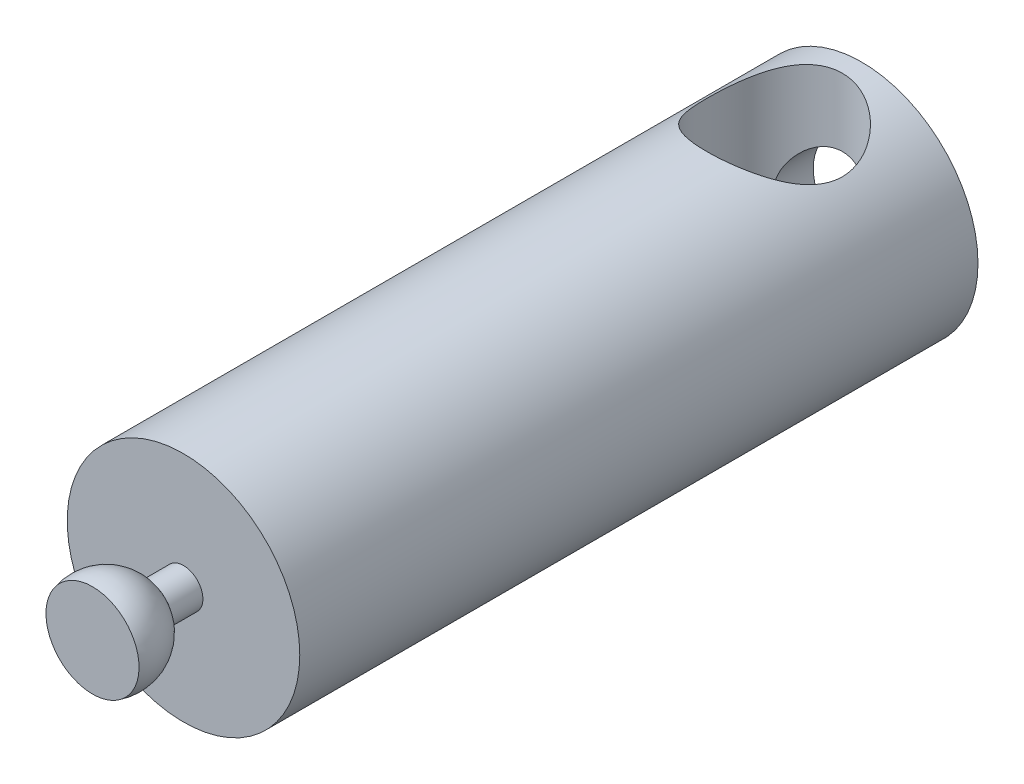
ISO-10303-21;
HEADER;
FILE_DESCRIPTION(('STEP AP214'),'2;1');
FILE_NAME('part.step','',(''),(''),'','','');
FILE_SCHEMA(('AUTOMOTIVE_DESIGN { 1 0 10303 214 1 1 1 1 }'));
ENDSEC;
DATA;
#1=APPLICATION_CONTEXT('core data for automotive mechanical design processes');
#2=APPLICATION_PROTOCOL_DEFINITION('international standard','automotive_design',2000,#1);
#3=PRODUCT_CONTEXT('',#1,'mechanical');
#4=PRODUCT('Part','Part','',(#3));
#5=PRODUCT_RELATED_PRODUCT_CATEGORY('part','',(#4));
#6=PRODUCT_DEFINITION_FORMATION('','',#4);
#7=PRODUCT_DEFINITION_CONTEXT('part definition',#1,'design');
#8=PRODUCT_DEFINITION('design','',#6,#7);
#9=PRODUCT_DEFINITION_SHAPE('','',#8);
#10=(LENGTH_UNIT() NAMED_UNIT(*) SI_UNIT(.MILLI.,.METRE.));
#11=(NAMED_UNIT(*) PLANE_ANGLE_UNIT() SI_UNIT($,.RADIAN.));
#12=(NAMED_UNIT(*) SI_UNIT($,.STERADIAN.) SOLID_ANGLE_UNIT());
#13=UNCERTAINTY_MEASURE_WITH_UNIT(LENGTH_MEASURE(1.E-05),#10,'distance_accuracy_value','');
#14=(GEOMETRIC_REPRESENTATION_CONTEXT(3) GLOBAL_UNCERTAINTY_ASSIGNED_CONTEXT((#13)) GLOBAL_UNIT_ASSIGNED_CONTEXT((#10,
#11,#12)) REPRESENTATION_CONTEXT('',''));
#15=CARTESIAN_POINT('',(0.,0.,0.));
#16=DIRECTION('',(0.,0.,1.));
#17=DIRECTION('',(1.,0.,0.));
#18=AXIS2_PLACEMENT_3D('',#15,#16,#17);
#19=CARTESIAN_POINT('',(0.,0.,8.));
#20=DIRECTION('',(0.,0.,-1.));
#21=DIRECTION('',(-1.,0.,0.));
#22=AXIS2_PLACEMENT_3D('',#19,#20,#21);
#23=PLANE('',#22);
#24=CARTESIAN_POINT('',(0.,0.,8.));
#25=DIRECTION('',(0.,0.,-1.));
#26=DIRECTION('',(-1.,0.,0.));
#27=AXIS2_PLACEMENT_3D('',#24,#25,#26);
#28=CIRCLE('',#27,2.5);
#29=CARTESIAN_POINT('',(0.,-2.5,8.));
#30=VERTEX_POINT('',#29);
#31=CARTESIAN_POINT('',(0.,2.5,8.));
#32=VERTEX_POINT('',#31);
#33=EDGE_CURVE('E56',#30,#32,#28,.T.);
#34=ORIENTED_EDGE('',*,*,#33,.T.);
#35=EDGE_CURVE('E49',#32,#30,#28,.T.);
#36=ORIENTED_EDGE('',*,*,#35,.T.);
#37=EDGE_LOOP('',(#34,#36));
#38=FACE_BOUND('',#37,.T.);
#39=CARTESIAN_POINT('',(0.,0.,8.));
#40=DIRECTION('',(0.,0.,-1.));
#41=DIRECTION('',(-1.,0.,0.));
#42=AXIS2_PLACEMENT_3D('',#39,#40,#41);
#43=CIRCLE('',#42,1.);
#44=CARTESIAN_POINT('',(-1.,0.,8.));
#45=VERTEX_POINT('',#44);
#46=EDGE_CURVE('E117',#45,#45,#43,.T.);
#47=ORIENTED_EDGE('',*,*,#46,.F.);
#48=EDGE_LOOP('',(#47));
#49=FACE_BOUND('',#48,.T.);
#50=ADVANCED_FACE('F34',(#38,#49),#23,.T.);
#51=CARTESIAN_POINT('',(0.,0.,35.));
#52=DIRECTION('',(0.,0.,-1.));
#53=DIRECTION('',(-1.,0.,0.));
#54=AXIS2_PLACEMENT_3D('',#51,#52,#53);
#55=CYLINDRICAL_SURFACE('',#54,6.);
#56=CARTESIAN_POINT('',(0.,-6.,8.));
#57=CARTESIAN_POINT('',(0.0899621842016999,-5.99999940705532,7.999999344979));
#58=CARTESIAN_POINT('',(0.179959123472136,-5.99797113274336,7.99652549070914));
#59=CARTESIAN_POINT('',(0.359279181505375,-5.98990699740743,7.98267375145587));
#60=CARTESIAN_POINT('',(0.448601797816938,-5.98386839889512,7.97229115048177));
#61=CARTESIAN_POINT('',(0.626048243263435,-5.96791503780685,7.94472607587532));
#62=CARTESIAN_POINT('',(0.714169031319306,-5.95799184607172,7.92752881414367));
#63=CARTESIAN_POINT('',(0.888388196147668,-5.93451883712606,7.88656029192718));
#64=CARTESIAN_POINT('',(0.974485683925673,-5.92096745701802,7.86278619822453));
#65=CARTESIAN_POINT('',(1.22795193693791,-5.87549044108281,7.78228254868244));
#66=CARTESIAN_POINT('',(1.39157911080687,-5.83863857796371,7.71619899902307));
#67=CARTESIAN_POINT('',(1.70485306237609,-5.75498500284211,7.56170731941832));
#68=CARTESIAN_POINT('',(1.85450459024161,-5.7081866893732,7.47330681286643));
#69=CARTESIAN_POINT('',(2.14825204388916,-5.60455210541238,7.26934942490433));
#70=CARTESIAN_POINT('',(2.29111541335043,-5.54722907494987,7.15226606318091));
#71=CARTESIAN_POINT('',(2.55637666788825,-5.4301030544073,6.89766667401416));
#72=CARTESIAN_POINT('',(2.67874880147822,-5.37029705995946,6.76012534051895));
#73=CARTESIAN_POINT('',(2.91372645980217,-5.24687865780905,6.4499418739621));
#74=CARTESIAN_POINT('',(3.023613987063,-5.18361328174864,6.27508434232938));
#75=CARTESIAN_POINT('',(3.21198955709959,-5.06905701564854,5.90567797214929));
#76=CARTESIAN_POINT('',(3.29052679284978,-5.0177474184173,5.71116058858183));
#77=CARTESIAN_POINT('',(3.3981959438312,-4.94524723148708,5.35362266177146));
#78=CARTESIAN_POINT('',(3.43453185280106,-4.91984581185326,5.19362774822004));
#79=CARTESIAN_POINT('',(3.48441762747016,-4.88464999348731,4.86851077352308));
#80=CARTESIAN_POINT('',(3.4979934668325,-4.87483780508295,4.70339477609203));
#81=CARTESIAN_POINT('',(3.50159501400216,-4.87225207387588,4.37250765848925));
#82=CARTESIAN_POINT('',(3.49158314435522,-4.87950571853604,4.20673591356244));
#83=CARTESIAN_POINT('',(3.44854447624329,-4.91001053927536,3.87968395128125));
#84=CARTESIAN_POINT('',(3.41550121705183,-4.93327315695062,3.71840703220671));
#85=CARTESIAN_POINT('',(3.32840818064216,-4.99243522012918,3.40551007740121));
#86=CARTESIAN_POINT('',(3.27451478757804,-5.02824040676167,3.25382770797727));
#87=CARTESIAN_POINT('',(3.14763556587525,-5.10862226659795,2.96121540476717));
#88=CARTESIAN_POINT('',(3.07464255582214,-5.15320223753611,2.82028954120327));
#89=CARTESIAN_POINT('',(2.8976053982461,-5.25508726886635,2.52828062995961));
#90=CARTESIAN_POINT('',(2.79041543853219,-5.31327541003335,2.37940953620583));
#91=CARTESIAN_POINT('',(2.55439792135506,-5.43069826274646,2.10030615153668));
#92=CARTESIAN_POINT('',(2.4255509421862,-5.48993387059701,1.97009078671601));
#93=CARTESIAN_POINT('',(2.1306271041862,-5.61148764416563,1.71561404503905));
#94=CARTESIAN_POINT('',(1.96191474322216,-5.67327691399843,1.59409422941144));
#95=CARTESIAN_POINT('',(1.69274613625394,-5.7570400122716,1.43478847963492));
#96=CARTESIAN_POINT('',(1.60029853664453,-5.78348329258615,1.38550000132137));
#97=CARTESIAN_POINT('',(1.41056352156908,-5.8326567590854,1.29510843850777));
#98=CARTESIAN_POINT('',(1.31327910935177,-5.85538921272546,1.25400035208943));
#99=CARTESIAN_POINT('',(1.12118402811535,-5.8950760463397,1.18296390008847));
#100=CARTESIAN_POINT('',(1.02663935486807,-5.91231421426126,1.15247371851615));
#101=CARTESIAN_POINT('',(0.834695284408373,-5.94244994910546,1.09953151504973));
#102=CARTESIAN_POINT('',(0.737297481922027,-5.95534989234232,1.07707509213726));
#103=CARTESIAN_POINT('',(0.540500524879268,-5.97642417050811,1.04053925562981));
#104=CARTESIAN_POINT('',(0.441102681196727,-5.98460150264121,1.02645452877361));
#105=CARTESIAN_POINT('',(0.24118752147363,-5.99598613235849,1.00687624700017));
#106=CARTESIAN_POINT('',(0.140670344887629,-5.99919404224354,1.00138163366257));
#107=CARTESIAN_POINT('',(-0.0476500287328656,-6.00045229485502,0.99922465385498));
#108=CARTESIAN_POINT('',(-0.135438590848441,-5.99910862745508,1.00152455820664));
#109=CARTESIAN_POINT('',(-0.310461993330544,-5.99260403927114,1.01269182949206));
#110=CARTESIAN_POINT('',(-0.39769665293615,-5.98744193105945,1.02156123935841));
#111=CARTESIAN_POINT('',(-0.657520099512283,-5.96638262286715,1.05788512114811));
#112=CARTESIAN_POINT('',(-0.828422689977264,-5.94491336191052,1.09505335352384));
#113=CARTESIAN_POINT('',(-1.15808876666692,-5.8895184376044,1.19273559942258));
#114=CARTESIAN_POINT('',(-1.31700110317444,-5.85579439314154,1.25287250114682));
#115=CARTESIAN_POINT('',(-1.62255442838773,-5.77859485954367,1.39425308799117));
#116=CARTESIAN_POINT('',(-1.76919268722314,-5.73511720898612,1.4755014520946));
#117=CARTESIAN_POINT('',(-2.06250330843421,-5.63670505849237,1.6663068517907));
#118=CARTESIAN_POINT('',(-2.20758407137202,-5.58104858397804,1.77793260505315));
#119=CARTESIAN_POINT('',(-2.4780793032594,-5.46632933394456,2.02162906369722));
#120=CARTESIAN_POINT('',(-2.60347056780368,-5.40726264985705,2.15372353307513));
#121=CARTESIAN_POINT('',(-2.84636081556061,-5.2838349558923,2.45312112891092));
#122=CARTESIAN_POINT('',(-2.96112553039478,-5.2196848827806,2.62274539799034));
#123=CARTESIAN_POINT('',(-3.16038820338437,-5.10151027475494,2.98210071946081));
#124=CARTESIAN_POINT('',(-3.24492348040676,-5.04747329459455,3.17180660289635));
#125=CARTESIAN_POINT('',(-3.36531429748045,-4.96776744065978,3.52454779574634));
#126=CARTESIAN_POINT('',(-3.40773412765483,-4.93849487756635,3.68452221652442));
#127=CARTESIAN_POINT('',(-3.46960492167826,-4.89523317923762,4.01079093510767));
#128=CARTESIAN_POINT('',(-3.489084460678,-4.88122503179369,4.17707710357673));
#129=CARTESIAN_POINT('',(-3.50399594756399,-4.87053514207999,4.5117532202431));
#130=CARTESIAN_POINT('',(-3.49936339883644,-4.87389986973792,4.68014760767355));
#131=CARTESIAN_POINT('',(-3.46619534757535,-4.89753765573747,5.01338781935982));
#132=CARTESIAN_POINT('',(-3.43764527821143,-4.91782101824514,5.17823141825647));
#133=CARTESIAN_POINT('',(-3.35939658034854,-4.97157869971425,5.49516134899973));
#134=CARTESIAN_POINT('',(-3.31034376760202,-5.00464806903079,5.64748017565885));
#135=CARTESIAN_POINT('',(-3.19308606788782,-5.08026146937039,5.94199861353435));
#136=CARTESIAN_POINT('',(-3.12487392945043,-5.12280908648058,6.08419436775334));
#137=CARTESIAN_POINT('',(-2.95904753922133,-5.22059857811583,6.3779562012529));
#138=CARTESIAN_POINT('',(-2.85851524848139,-5.27678588540072,6.52756049479073));
#139=CARTESIAN_POINT('',(-2.63624236878869,-5.39128042536153,6.80921697519905));
#140=CARTESIAN_POINT('',(-2.51448515863006,-5.44958929089827,6.94125526220364));
#141=CARTESIAN_POINT('',(-2.23286219445595,-5.57143917603496,7.20299413509767));
#142=CARTESIAN_POINT('',(-2.07004703111802,-5.63456802501059,7.32977305151315));
#143=CARTESIAN_POINT('',(-1.80920666729129,-5.72147203378955,7.49791924302711));
#144=CARTESIAN_POINT('',(-1.71941205496244,-5.74916078272634,7.55033058248405));
#145=CARTESIAN_POINT('',(-1.53476261972514,-5.80117891858142,7.64727760192882));
#146=CARTESIAN_POINT('',(-1.4399107884699,-5.8255102617016,7.69181787230003));
#147=CARTESIAN_POINT('',(-1.25031817720422,-5.86904784303838,7.77058817523679));
#148=CARTESIAN_POINT('',(-1.15578010730151,-5.88844069632128,7.80520328441335));
#149=CARTESIAN_POINT('',(-0.963403250723157,-5.92295472951742,7.86630793151274));
#150=CARTESIAN_POINT('',(-0.865566420334689,-5.93807839302157,7.89280219449156));
#151=CARTESIAN_POINT('',(-0.667677878357151,-5.96356695531817,7.93721698560878));
#152=CARTESIAN_POINT('',(-0.567633831399916,-5.9739462261897,7.95516341453391));
#153=CARTESIAN_POINT('',(-0.366031363492446,-5.9896765248691,7.9822906809512));
#154=CARTESIAN_POINT('',(-0.264474378789153,-5.99503204684263,7.99147935311125));
#155=CARTESIAN_POINT('',(-0.135600842842583,-5.99852897810343,7.99747764565677));
#156=CARTESIAN_POINT('',(-0.108493391182483,-5.99908033765356,7.99842322822449));
#157=CARTESIAN_POINT('',(-0.0542583467885913,-5.99981593957898,7.99968450685542));
#158=CARTESIAN_POINT('',(-0.0271307538848228,-6.00000017881998,8.00000019754093));
#159=CARTESIAN_POINT('',(0.,-6.,8.));
#160=B_SPLINE_CURVE_WITH_KNOTS('',3,(#56,#57,#58,#59,#60,#61,#62,#63,#64,#65,#66,#67,#68,#69,
#70,#71,#72,#73,#74,#75,#76,#77,#78,#79,#80,#81,#82,#83,#84,#85,#86,#87,#88,#89,#90,#91,#92,#93,
#94,#95,#96,#97,#98,#99,#100,#101,#102,#103,#104,#105,#106,#107,#108,#109,#110,#111,#112,#113,
#114,#115,#116,#117,#118,#119,#120,#121,#122,#123,#124,#125,#126,#127,#128,#129,#130,#131,#132,
#133,#134,#135,#136,#137,#138,#139,#140,#141,#142,#143,#144,#145,#146,#147,#148,#149,#150,#151,
#152,#153,#154,#155,#156,#157,#158,#159),.UNSPECIFIED.,.T.,.F.,(4,2,2,2,2,2,2,2,2,2,2,2,2,2,2,2,
2,2,2,2,2,2,2,2,2,2,2,2,2,2,2,2,2,2,2,2,2,2,2,2,2,2,2,2,2,2,2,2,2,2,2,4),(0.,0.269857022230553,
0.539898441223979,0.81052909898963,1.08127652312956,1.61950432452768,2.15754851740577,
2.73544583741866,3.31406404167448,3.9588634393916,4.60264704184033,5.09858348127047,
5.59395357461927,6.0901133729436,6.58662814492187,7.07948888602377,7.57253520864789,
8.14762469114195,8.72323268451364,9.37023224992074,9.69399877078184,10.0175667114708,
10.3196086145674,10.6214848001053,10.9231691888501,11.2248164029905,11.4879654567385,
11.7511963768611,12.2770829521784,12.7946826161502,13.3123970949539,13.8841084077748,
14.4564885153885,15.0972759394319,15.737269544695,16.2393630156573,16.7408303993928,
17.2436398295979,17.746755715859,18.2350938681074,18.7236170974388,19.2878323305452,
19.852491401133,20.4962952131074,20.8187115384658,21.1409392065765,21.4480807758936,
21.7550432963678,22.0610696775496,22.3668220305958,22.4482046916946,22.5295880475924),.UNSPECIFIED.);
#161=CARTESIAN_POINT('',(0.,-6.,8.));
#162=VERTEX_POINT('',#161);
#163=EDGE_CURVE('E75',#162,#162,#160,.T.);
#164=ORIENTED_EDGE('',*,*,#163,.T.);
#165=EDGE_LOOP('',(#164));
#166=FACE_BOUND('',#165,.T.);
#167=CARTESIAN_POINT('',(0.,6.,8.));
#168=CARTESIAN_POINT('',(-0.0899621842016999,5.99999940705532,7.999999344979));
#169=CARTESIAN_POINT('',(-0.179959123472136,5.99797113274336,7.99652549070914));
#170=CARTESIAN_POINT('',(-0.359279181505375,5.98990699740743,7.98267375145587));
#171=CARTESIAN_POINT('',(-0.448601797816938,5.98386839889512,7.97229115048177));
#172=CARTESIAN_POINT('',(-0.626048243263435,5.96791503780685,7.94472607587532));
#173=CARTESIAN_POINT('',(-0.714169031319306,5.95799184607172,7.92752881414367));
#174=CARTESIAN_POINT('',(-0.888388196147668,5.93451883712606,7.88656029192718));
#175=CARTESIAN_POINT('',(-0.974485683925673,5.92096745701802,7.86278619822453));
#176=CARTESIAN_POINT('',(-1.22795193693791,5.87549044108281,7.78228254868244));
#177=CARTESIAN_POINT('',(-1.39157911080687,5.83863857796371,7.71619899902307));
#178=CARTESIAN_POINT('',(-1.70485306237609,5.75498500284211,7.56170731941832));
#179=CARTESIAN_POINT('',(-1.85450459024161,5.7081866893732,7.47330681286643));
#180=CARTESIAN_POINT('',(-2.14825204388916,5.60455210541238,7.26934942490433));
#181=CARTESIAN_POINT('',(-2.29111541335043,5.54722907494987,7.15226606318091));
#182=CARTESIAN_POINT('',(-2.55637666788825,5.4301030544073,6.89766667401416));
#183=CARTESIAN_POINT('',(-2.67874880147822,5.37029705995946,6.76012534051895));
#184=CARTESIAN_POINT('',(-2.91372645980217,5.24687865780905,6.4499418739621));
#185=CARTESIAN_POINT('',(-3.023613987063,5.18361328174864,6.27508434232938));
#186=CARTESIAN_POINT('',(-3.21198955709959,5.06905701564854,5.90567797214929));
#187=CARTESIAN_POINT('',(-3.29052679284978,5.0177474184173,5.71116058858183));
#188=CARTESIAN_POINT('',(-3.3981959438312,4.94524723148708,5.35362266177146));
#189=CARTESIAN_POINT('',(-3.43453185280106,4.91984581185326,5.19362774822004));
#190=CARTESIAN_POINT('',(-3.48441762747016,4.88464999348731,4.86851077352308));
#191=CARTESIAN_POINT('',(-3.4979934668325,4.87483780508295,4.70339477609203));
#192=CARTESIAN_POINT('',(-3.50159501400216,4.87225207387588,4.37250765848925));
#193=CARTESIAN_POINT('',(-3.49158314435522,4.87950571853604,4.20673591356244));
#194=CARTESIAN_POINT('',(-3.44854447624329,4.91001053927536,3.87968395128125));
#195=CARTESIAN_POINT('',(-3.41550121705183,4.93327315695062,3.71840703220671));
#196=CARTESIAN_POINT('',(-3.32840818064216,4.99243522012918,3.40551007740121));
#197=CARTESIAN_POINT('',(-3.27451478757804,5.02824040676167,3.25382770797727));
#198=CARTESIAN_POINT('',(-3.14763556587525,5.10862226659795,2.96121540476717));
#199=CARTESIAN_POINT('',(-3.07464255582214,5.15320223753611,2.82028954120327));
#200=CARTESIAN_POINT('',(-2.8976053982461,5.25508726886635,2.52828062995961));
#201=CARTESIAN_POINT('',(-2.79041543853219,5.31327541003335,2.37940953620583));
#202=CARTESIAN_POINT('',(-2.55439792135506,5.43069826274646,2.10030615153668));
#203=CARTESIAN_POINT('',(-2.4255509421862,5.48993387059701,1.97009078671601));
#204=CARTESIAN_POINT('',(-2.1306271041862,5.61148764416563,1.71561404503905));
#205=CARTESIAN_POINT('',(-1.96191474322216,5.67327691399843,1.59409422941144));
#206=CARTESIAN_POINT('',(-1.69274613625394,5.7570400122716,1.43478847963492));
#207=CARTESIAN_POINT('',(-1.60029853664453,5.78348329258615,1.38550000132137));
#208=CARTESIAN_POINT('',(-1.41056352156908,5.8326567590854,1.29510843850777));
#209=CARTESIAN_POINT('',(-1.31327910935177,5.85538921272546,1.25400035208943));
#210=CARTESIAN_POINT('',(-1.12118402811535,5.8950760463397,1.18296390008847));
#211=CARTESIAN_POINT('',(-1.02663935486807,5.91231421426126,1.15247371851615));
#212=CARTESIAN_POINT('',(-0.834695284408373,5.94244994910546,1.09953151504973));
#213=CARTESIAN_POINT('',(-0.737297481922027,5.95534989234232,1.07707509213726));
#214=CARTESIAN_POINT('',(-0.540500524879268,5.97642417050811,1.04053925562981));
#215=CARTESIAN_POINT('',(-0.441102681196727,5.98460150264121,1.02645452877361));
#216=CARTESIAN_POINT('',(-0.24118752147363,5.99598613235849,1.00687624700017));
#217=CARTESIAN_POINT('',(-0.140670344887629,5.99919404224354,1.00138163366257));
#218=CARTESIAN_POINT('',(0.0476500287328656,6.00045229485502,0.99922465385498));
#219=CARTESIAN_POINT('',(0.135438590848441,5.99910862745508,1.00152455820664));
#220=CARTESIAN_POINT('',(0.310461993330544,5.99260403927114,1.01269182949206));
#221=CARTESIAN_POINT('',(0.39769665293615,5.98744193105945,1.02156123935841));
#222=CARTESIAN_POINT('',(0.657520099512283,5.96638262286715,1.05788512114811));
#223=CARTESIAN_POINT('',(0.828422689977264,5.94491336191052,1.09505335352384));
#224=CARTESIAN_POINT('',(1.15808876666692,5.8895184376044,1.19273559942258));
#225=CARTESIAN_POINT('',(1.31700110317444,5.85579439314154,1.25287250114682));
#226=CARTESIAN_POINT('',(1.62255442838773,5.77859485954367,1.39425308799117));
#227=CARTESIAN_POINT('',(1.76919268722314,5.73511720898612,1.4755014520946));
#228=CARTESIAN_POINT('',(2.06250330843421,5.63670505849237,1.6663068517907));
#229=CARTESIAN_POINT('',(2.20758407137202,5.58104858397804,1.77793260505315));
#230=CARTESIAN_POINT('',(2.4780793032594,5.46632933394456,2.02162906369722));
#231=CARTESIAN_POINT('',(2.60347056780368,5.40726264985705,2.15372353307513));
#232=CARTESIAN_POINT('',(2.84636081556061,5.2838349558923,2.45312112891092));
#233=CARTESIAN_POINT('',(2.96112553039478,5.2196848827806,2.62274539799034));
#234=CARTESIAN_POINT('',(3.16038820338437,5.10151027475494,2.98210071946081));
#235=CARTESIAN_POINT('',(3.24492348040676,5.04747329459455,3.17180660289635));
#236=CARTESIAN_POINT('',(3.36531429748045,4.96776744065978,3.52454779574634));
#237=CARTESIAN_POINT('',(3.40773412765483,4.93849487756635,3.68452221652442));
#238=CARTESIAN_POINT('',(3.46960492167826,4.89523317923762,4.01079093510767));
#239=CARTESIAN_POINT('',(3.489084460678,4.88122503179369,4.17707710357673));
#240=CARTESIAN_POINT('',(3.50399594756399,4.87053514207999,4.5117532202431));
#241=CARTESIAN_POINT('',(3.49936339883644,4.87389986973792,4.68014760767355));
#242=CARTESIAN_POINT('',(3.46619534757535,4.89753765573747,5.01338781935982));
#243=CARTESIAN_POINT('',(3.43764527821143,4.91782101824514,5.17823141825647));
#244=CARTESIAN_POINT('',(3.35939658034854,4.97157869971425,5.49516134899973));
#245=CARTESIAN_POINT('',(3.31034376760202,5.00464806903079,5.64748017565885));
#246=CARTESIAN_POINT('',(3.19308606788782,5.08026146937039,5.94199861353435));
#247=CARTESIAN_POINT('',(3.12487392945043,5.12280908648058,6.08419436775334));
#248=CARTESIAN_POINT('',(2.95904753922133,5.22059857811583,6.3779562012529));
#249=CARTESIAN_POINT('',(2.85851524848139,5.27678588540072,6.52756049479073));
#250=CARTESIAN_POINT('',(2.63624236878869,5.39128042536153,6.80921697519905));
#251=CARTESIAN_POINT('',(2.51448515863006,5.44958929089827,6.94125526220364));
#252=CARTESIAN_POINT('',(2.23286219445595,5.57143917603496,7.20299413509767));
#253=CARTESIAN_POINT('',(2.07004703111802,5.63456802501059,7.32977305151315));
#254=CARTESIAN_POINT('',(1.80920666729129,5.72147203378955,7.49791924302711));
#255=CARTESIAN_POINT('',(1.71941205496244,5.74916078272634,7.55033058248405));
#256=CARTESIAN_POINT('',(1.53476261972514,5.80117891858142,7.64727760192882));
#257=CARTESIAN_POINT('',(1.4399107884699,5.8255102617016,7.69181787230003));
#258=CARTESIAN_POINT('',(1.25031817720422,5.86904784303838,7.77058817523679));
#259=CARTESIAN_POINT('',(1.15578010730151,5.88844069632128,7.80520328441335));
#260=CARTESIAN_POINT('',(0.963403250723157,5.92295472951742,7.86630793151274));
#261=CARTESIAN_POINT('',(0.865566420334689,5.93807839302157,7.89280219449156));
#262=CARTESIAN_POINT('',(0.667677878357151,5.96356695531817,7.93721698560878));
#263=CARTESIAN_POINT('',(0.567633831399916,5.9739462261897,7.95516341453391));
#264=CARTESIAN_POINT('',(0.366031363492446,5.9896765248691,7.9822906809512));
#265=CARTESIAN_POINT('',(0.264474378789153,5.99503204684263,7.99147935311125));
#266=CARTESIAN_POINT('',(0.135600842842583,5.99852897810343,7.99747764565677));
#267=CARTESIAN_POINT('',(0.108493391182483,5.99908033765356,7.99842322822449));
#268=CARTESIAN_POINT('',(0.0542583467885913,5.99981593957898,7.99968450685542));
#269=CARTESIAN_POINT('',(0.0271307538848228,6.00000017881998,8.00000019754093));
#270=CARTESIAN_POINT('',(0.,6.,8.));
#271=B_SPLINE_CURVE_WITH_KNOTS('',3,(#167,#168,#169,#170,#171,#172,#173,#174,#175,#176,#177,
#178,#179,#180,#181,#182,#183,#184,#185,#186,#187,#188,#189,#190,#191,#192,#193,#194,#195,#196,
#197,#198,#199,#200,#201,#202,#203,#204,#205,#206,#207,#208,#209,#210,#211,#212,#213,#214,#215,
#216,#217,#218,#219,#220,#221,#222,#223,#224,#225,#226,#227,#228,#229,#230,#231,#232,#233,#234,
#235,#236,#237,#238,#239,#240,#241,#242,#243,#244,#245,#246,#247,#248,#249,#250,#251,#252,#253,
#254,#255,#256,#257,#258,#259,#260,#261,#262,#263,#264,#265,#266,#267,#268,#269,#270),
.UNSPECIFIED.,.T.,.F.,(4,2,2,2,2,2,2,2,2,2,2,2,2,2,2,2,2,2,2,2,2,2,2,2,2,2,2,2,2,2,2,2,2,2,2,2,
2,2,2,2,2,2,2,2,2,2,2,2,2,2,2,4),(0.,0.269857022230553,0.539898441223979,0.81052909898963,
1.08127652312956,1.61950432452768,2.15754851740577,2.73544583741866,3.31406404167448,
3.9588634393916,4.60264704184033,5.09858348127047,5.59395357461927,6.0901133729436,
6.58662814492187,7.07948888602377,7.57253520864789,8.14762469114195,8.72323268451364,
9.37023224992074,9.69399877078184,10.0175667114708,10.3196086145674,10.6214848001053,
10.9231691888501,11.2248164029905,11.4879654567385,11.7511963768611,12.2770829521784,
12.7946826161502,13.3123970949539,13.8841084077748,14.4564885153885,15.0972759394319,
15.737269544695,16.2393630156573,16.7408303993928,17.2436398295979,17.746755715859,
18.2350938681074,18.7236170974388,19.2878323305452,19.852491401133,20.4962952131074,
20.8187115384658,21.1409392065765,21.4480807758936,21.7550432963678,22.0610696775496,
22.3668220305958,22.4482046916946,22.5295880475924),.UNSPECIFIED.);
#272=CARTESIAN_POINT('',(0.,6.,8.));
#273=VERTEX_POINT('',#272);
#274=EDGE_CURVE('E131',#273,#273,#271,.T.);
#275=ORIENTED_EDGE('',*,*,#274,.T.);
#276=EDGE_LOOP('',(#275));
#277=FACE_BOUND('',#276,.T.);
#278=CARTESIAN_POINT('',(0.,0.,35.));
#279=DIRECTION('',(0.,0.,1.));
#280=DIRECTION('',(1.,0.,0.));
#281=AXIS2_PLACEMENT_3D('',#278,#279,#280);
#282=CIRCLE('',#281,6.);
#283=CARTESIAN_POINT('',(6.,0.,35.));
#284=VERTEX_POINT('',#283);
#285=EDGE_CURVE('E60',#284,#284,#282,.T.);
#286=ORIENTED_EDGE('',*,*,#285,.F.);
#287=EDGE_LOOP('',(#286));
#288=FACE_BOUND('',#287,.T.);
#289=CARTESIAN_POINT('',(0.,0.,0.));
#290=DIRECTION('',(0.,0.,1.));
#291=DIRECTION('',(1.,0.,0.));
#292=AXIS2_PLACEMENT_3D('',#289,#290,#291);
#293=CIRCLE('',#292,6.);
#294=CARTESIAN_POINT('',(6.,0.,0.));
#295=VERTEX_POINT('',#294);
#296=EDGE_CURVE('E127',#295,#295,#293,.T.);
#297=ORIENTED_EDGE('',*,*,#296,.T.);
#298=EDGE_LOOP('',(#297));
#299=FACE_BOUND('',#298,.T.);
#300=ADVANCED_FACE('F36',(#166,#277,#288,#299),#55,.T.);
#301=CARTESIAN_POINT('',(0.,0.,35.));
#302=DIRECTION('',(0.,0.,1.));
#303=DIRECTION('',(1.,0.,0.));
#304=AXIS2_PLACEMENT_3D('',#301,#302,#303);
#305=PLANE('',#304);
#306=CARTESIAN_POINT('',(0.,0.,35.));
#307=DIRECTION('',(0.,0.,1.));
#308=DIRECTION('',(1.,0.,0.));
#309=AXIS2_PLACEMENT_3D('',#306,#307,#308);
#310=CIRCLE('',#309,1.);
#311=CARTESIAN_POINT('',(1.,0.,35.));
#312=VERTEX_POINT('',#311);
#313=EDGE_CURVE('E11',#312,#312,#310,.T.);
#314=ORIENTED_EDGE('',*,*,#313,.F.);
#315=EDGE_LOOP('',(#314));
#316=FACE_BOUND('',#315,.T.);
#317=ORIENTED_EDGE('',*,*,#285,.T.);
#318=EDGE_LOOP('',(#317));
#319=FACE_BOUND('',#318,.T.);
#320=ADVANCED_FACE('F210',(#316,#319),#305,.T.);
#321=CARTESIAN_POINT('',(0.,0.,0.));
#322=DIRECTION('',(0.,0.,1.));
#323=DIRECTION('',(1.,0.,0.));
#324=AXIS2_PLACEMENT_3D('',#321,#322,#323);
#325=PLANE('',#324);
#326=CARTESIAN_POINT('',(0.,0.,0.));
#327=DIRECTION('',(0.,0.,-1.));
#328=DIRECTION('',(-1.,0.,0.));
#329=AXIS2_PLACEMENT_3D('',#326,#327,#328);
#330=CIRCLE('',#329,2.5);
#331=CARTESIAN_POINT('',(-2.5,0.,0.));
#332=VERTEX_POINT('',#331);
#333=EDGE_CURVE('E63',#332,#332,#330,.T.);
#334=ORIENTED_EDGE('',*,*,#333,.F.);
#335=EDGE_LOOP('',(#334));
#336=FACE_BOUND('',#335,.T.);
#337=ORIENTED_EDGE('',*,*,#296,.F.);
#338=EDGE_LOOP('',(#337));
#339=FACE_BOUND('',#338,.T.);
#340=ADVANCED_FACE('F147',(#336,#339),#325,.F.);
#341=CARTESIAN_POINT('',(0.,-17.5,4.5));
#342=DIRECTION('',(0.,1.,0.));
#343=DIRECTION('',(0.,0.,1.));
#344=AXIS2_PLACEMENT_3D('',#341,#342,#343);
#345=CYLINDRICAL_SURFACE('',#344,3.5);
#346=CARTESIAN_POINT('',(-2.5,0.,2.05051025721682));
#347=CARTESIAN_POINT('',(-2.50000008307986,0.0595437106329497,2.05051046198886));
#348=CARTESIAN_POINT('',(-2.49786660659943,0.119086436462475,2.04832650321261));
#349=CARTESIAN_POINT('',(-2.48939639218125,0.23757557283056,2.03972807883892));
#350=CARTESIAN_POINT('',(-2.48305754842775,0.296521669589108,2.03331149378514));
#351=CARTESIAN_POINT('',(-2.45790532115244,0.471813802352573,2.00815506890872));
#352=CARTESIAN_POINT('',(-2.43295665240151,0.586498019394557,1.98350955589207));
#353=CARTESIAN_POINT('',(-2.36895101285965,0.806944816876994,1.92319248376528));
#354=CARTESIAN_POINT('',(-2.33006279022612,0.912796194156667,1.88765351303002));
#355=CARTESIAN_POINT('',(-2.23974108711768,1.11621650244909,1.80981006351996));
#356=CARTESIAN_POINT('',(-2.18830809520747,1.21378575581545,1.76750584824437));
#357=CARTESIAN_POINT('',(-2.06335507760735,1.41751969017806,1.67160116174226));
#358=CARTESIAN_POINT('',(-1.98751158636828,1.52195596618389,1.61735547410889));
#359=CARTESIAN_POINT('',(-1.82058511502999,1.71816742439166,1.50911069709705));
#360=CARTESIAN_POINT('',(-1.72948196920773,1.80992555561569,1.45511203246493));
#361=CARTESIAN_POINT('',(-1.51515057128363,1.99439636068074,1.34224959166554));
#362=CARTESIAN_POINT('',(-1.38909031330179,2.08441421569328,1.28421148171829));
#363=CARTESIAN_POINT('',(-1.1865546298702,2.20185879759366,1.20646961144519));
#364=CARTESIAN_POINT('',(-1.11682337043763,2.23806890422528,1.18211374983762));
#365=CARTESIAN_POINT('',(-0.97326199122785,2.30412695052937,1.13720191498466));
#366=CARTESIAN_POINT('',(-0.899433778511979,2.33397781952023,1.11664419274668));
#367=CARTESIAN_POINT('',(-0.714757722344395,2.39842360791491,1.07192804926002));
#368=CARTESIAN_POINT('',(-0.601969079381502,2.42928476019379,1.05019358514386));
#369=CARTESIAN_POINT('',(-0.371714557114898,2.47499298390265,1.01785573748725));
#370=CARTESIAN_POINT('',(-0.254252582802319,2.4898531458315,1.00724325518202));
#371=CARTESIAN_POINT('',(-0.0176657677424759,2.50274742303506,0.998040136227748));
#372=CARTESIAN_POINT('',(0.101462066439368,2.50074585713761,0.999474992981455));
#373=CARTESIAN_POINT('',(0.337487754159482,2.47994918074624,1.01430120142838));
#374=CARTESIAN_POINT('',(0.454385004891486,2.46114959450703,1.02769573971594));
#375=CARTESIAN_POINT('',(0.679693407052132,2.40853978752676,1.06478124008709));
#376=CARTESIAN_POINT('',(0.788246129715222,2.37513225451446,1.08819564484925));
#377=CARTESIAN_POINT('',(0.997932841489391,2.29493891074344,1.14352800963692));
#378=CARTESIAN_POINT('',(1.09906531627568,2.24815037867898,1.17544769929956));
#379=CARTESIAN_POINT('',(1.30329917068145,2.13691485126298,1.24969287768369));
#380=CARTESIAN_POINT('',(1.40536259666555,2.07108055999881,1.29278180855476));
#381=CARTESIAN_POINT('',(1.59757774740133,1.9267124978097,1.38405843279474));
#382=CARTESIAN_POINT('',(1.68771722443517,1.84816585062256,1.432251278597));
#383=CARTESIAN_POINT('',(1.87089930689328,1.66420307206913,1.53976699231002));
#384=CARTESIAN_POINT('',(1.9614108165082,1.55650315386709,1.5995032137162));
#385=CARTESIAN_POINT('',(2.12378275350573,1.3264109094215,1.71620320682366));
#386=CARTESIAN_POINT('',(2.1956442130505,1.20401939681319,1.77316713181216));
#387=CARTESIAN_POINT('',(2.3049168673029,0.974510299233928,1.865371253181));
#388=CARTESIAN_POINT('',(2.34644193960731,0.870162699437319,1.90261445038899));
#389=CARTESIAN_POINT('',(2.415614393189,0.653917272017321,1.96680864417213));
#390=CARTESIAN_POINT('',(2.44328746344924,0.542033860467925,1.9937786702936));
#391=CARTESIAN_POINT('',(2.4732219649483,0.369661125165319,2.02343677113208));
#392=CARTESIAN_POINT('',(2.48128458251428,0.311053917850121,2.03153977620308));
#393=CARTESIAN_POINT('',(2.49324280178794,0.193006902693883,2.04361735218295));
#394=CARTESIAN_POINT('',(2.49714067110394,0.133567565807923,2.04759416967061));
#395=CARTESIAN_POINT('',(2.50066795026718,0.0144492734681499,2.0511907785458));
#396=CARTESIAN_POINT('',(2.50029884588415,-0.0452295913461829,2.05081208653166));
#397=CARTESIAN_POINT('',(2.49531288291151,-0.164206447807309,2.04573367550587));
#398=CARTESIAN_POINT('',(2.49069628622142,-0.223504462710227,2.04103422291145));
#399=CARTESIAN_POINT('',(2.47275078855874,-0.381312300486065,2.02295036703136));
#400=CARTESIAN_POINT('',(2.45562809147563,-0.47899580653746,2.00582932008265));
#401=CARTESIAN_POINT('',(2.410640472379,-0.669668794636473,1.96232904673575));
#402=CARTESIAN_POINT('',(2.38276290679705,-0.762652605593605,1.93593892677353));
#403=CARTESIAN_POINT('',(2.30162154734071,-0.986250800435989,1.86242931627135));
#404=CARTESIAN_POINT('',(2.24259540086997,-1.11350266922978,1.81144016492219));
#405=CARTESIAN_POINT('',(2.10582573050473,-1.35453985556953,1.70301211910217));
#406=CARTESIAN_POINT('',(2.02804474052118,-1.46829752873202,1.64556043872666));
#407=CARTESIAN_POINT('',(1.85312784875395,-1.6839251972605,1.52893482382249));
#408=CARTESIAN_POINT('',(1.75559315908709,-1.78546725076539,1.46975137108663));
#409=CARTESIAN_POINT('',(1.54331688123301,-1.97181802673858,1.35633636765261));
#410=CARTESIAN_POINT('',(1.42859939610046,-2.05664980954172,1.3020980489755));
#411=CARTESIAN_POINT('',(1.20143678094341,-2.19580443173875,1.21073839710532));
#412=CARTESIAN_POINT('',(1.09116965379627,-2.25278470148403,1.17227173470214));
#413=CARTESIAN_POINT('',(0.860760980775765,-2.35047141020132,1.10537995281085));
#414=CARTESIAN_POINT('',(0.740625099385913,-2.39118710713146,1.07694912190211));
#415=CARTESIAN_POINT('',(0.492513843791862,-2.45436433562489,1.03252341432902));
#416=CARTESIAN_POINT('',(0.364493535291681,-2.47670831833023,1.01660864770585));
#417=CARTESIAN_POINT('',(0.105575750324713,-2.50114612875279,0.999192407297193));
#418=CARTESIAN_POINT('',(-0.0253201741912314,-2.50325062295815,0.997683341512813));
#419=CARTESIAN_POINT('',(-0.271149336913014,-2.48797110877288,1.00858432719554));
#420=CARTESIAN_POINT('',(-0.386286879813447,-2.47265625832332,1.01951660965986));
#421=CARTESIAN_POINT('',(-0.611880581244257,-2.42669693585166,1.05201590310294));
#422=CARTESIAN_POINT('',(-0.722335942210633,-2.39604986342683,1.07358471806891));
#423=CARTESIAN_POINT('',(-0.938622183578509,-2.32001054719942,1.12632517851583));
#424=CARTESIAN_POINT('',(-1.04428329256542,-2.27428858505509,1.15771066413089));
#425=CARTESIAN_POINT('',(-1.24645015247123,-2.17009441939336,1.22771903309779));
#426=CARTESIAN_POINT('',(-1.34295420884927,-2.11161986254689,1.26634325208046));
#427=CARTESIAN_POINT('',(-1.53997825989659,-1.97359722473763,1.35486870452996));
#428=CARTESIAN_POINT('',(-1.6388241373156,-1.89219014270785,1.40559049192356));
#429=CARTESIAN_POINT('',(-1.82238683691836,-1.71613615958512,1.51000167448777));
#430=CARTESIAN_POINT('',(-1.90707682735716,-1.62146472693154,1.56369645412183));
#431=CARTESIAN_POINT('',(-2.07479876195784,-1.40263047702715,1.67914143426959));
#432=CARTESIAN_POINT('',(-2.155036498411,-1.27619625753481,1.74068745793195));
#433=CARTESIAN_POINT('',(-2.29291043085671,-1.00760940408258,1.85415129096203));
#434=CARTESIAN_POINT('',(-2.35058694625211,-0.865485397969225,1.9060861881142));
#435=CARTESIAN_POINT('',(-2.42914023407902,-0.602719767202217,1.97977873923247));
#436=CARTESIAN_POINT('',(-2.45550296689162,-0.484989517940959,2.00577364743044));
#437=CARTESIAN_POINT('',(-2.48208524424664,-0.304872951670374,2.03233034316611));
#438=CARTESIAN_POINT('',(-2.48878548014035,-0.244303623150184,2.03910943586862));
#439=CARTESIAN_POINT('',(-2.49774267674945,-0.122489154214156,2.04819914825717));
#440=CARTESIAN_POINT('',(-2.49999991454769,-0.0612440561815316,2.05051004659726));
#441=CARTESIAN_POINT('',(-2.5,0.,2.05051025721682));
#442=B_SPLINE_CURVE_WITH_KNOTS('',3,(#346,#347,#348,#349,#350,#351,#352,#353,#354,#355,#356,
#357,#358,#359,#360,#361,#362,#363,#364,#365,#366,#367,#368,#369,#370,#371,#372,#373,#374,#375,
#376,#377,#378,#379,#380,#381,#382,#383,#384,#385,#386,#387,#388,#389,#390,#391,#392,#393,#394,
#395,#396,#397,#398,#399,#400,#401,#402,#403,#404,#405,#406,#407,#408,#409,#410,#411,#412,#413,
#414,#415,#416,#417,#418,#419,#420,#421,#422,#423,#424,#425,#426,#427,#428,#429,#430,#431,#432,
#433,#434,#435,#436,#437,#438,#439,#440,#441),.UNSPECIFIED.,.T.,.F.,(4,2,2,2,2,2,2,2,2,2,2,2,2,
2,2,2,2,2,2,2,2,2,2,2,2,2,2,2,2,2,2,2,2,2,2,2,2,2,2,2,2,2,2,2,2,2,2,4),(0.,0.178547510494679,
0.35718449527553,0.714799385519697,1.06822371200246,1.42163427632784,1.84015848192281,
2.25924019758567,2.75235410859261,2.99877238158844,3.24507689787969,3.60023494817804,
3.95510222043187,4.31072061711672,4.66643379474052,5.01290504410518,5.35944680580556,
5.74463104321233,6.13020790144444,6.58690276407604,7.04357234614654,7.39737034215525,
7.75050975471735,7.92939424463485,8.1081812864074,8.28690607601023,8.46561984621702,
8.76616423511866,9.06706303006685,9.51240326967196,9.958640634483,10.4149938037261,
10.8707127198996,11.2589630953748,11.6469921588548,12.0374850652713,12.4277721652839,
12.7761348942163,13.1245567268231,13.4811699204585,13.837848978289,14.2495104354937,
14.6619435382223,15.1453627376489,15.6279140227028,15.9958933666625,16.1795509798635,
16.3631971390896),.UNSPECIFIED.);
#443=CARTESIAN_POINT('',(-2.5,0.,2.05051025721682));
#444=VERTEX_POINT('',#443);
#445=EDGE_CURVE('E67',#444,#444,#442,.T.);
#446=ORIENTED_EDGE('',*,*,#445,.T.);
#447=EDGE_LOOP('',(#446));
#448=FACE_BOUND('',#447,.T.);
#449=CARTESIAN_POINT('',(0.,-2.5,8.));
#450=CARTESIAN_POINT('',(0.123728813191223,-2.50000048270538,8.00000063992499));
#451=CARTESIAN_POINT('',(0.247452607509519,-2.49076208680868,7.9933837716556));
#452=CARTESIAN_POINT('',(0.490897056966881,-2.4544214069871,7.96756729775865));
#453=CARTESIAN_POINT('',(0.61061594651881,-2.42731135050089,7.94836221741437));
#454=CARTESIAN_POINT('',(0.842134278979703,-2.35698765496305,7.89922983630841));
#455=CARTESIAN_POINT('',(0.953970069083476,-2.31385458585613,7.8693562097146));
#456=CARTESIAN_POINT('',(1.16823399696302,-2.21342383575782,7.80119473506673));
#457=CARTESIAN_POINT('',(1.27066087203771,-2.15612425738166,7.76290575998324));
#458=CARTESIAN_POINT('',(1.4735973979734,-2.02348773380176,7.67674762370411));
#459=CARTESIAN_POINT('',(1.57311214719791,-1.94699433698738,7.62832735809472));
#460=CARTESIAN_POINT('',(1.75878471370038,-1.78106995588494,7.52784542835155));
#461=CARTESIAN_POINT('',(1.84492211922789,-1.69161959547859,7.47577837204529));
#462=CARTESIAN_POINT('',(2.01766896264091,-1.48342689638936,7.36208795270916));
#463=CARTESIAN_POINT('',(2.10145177248818,-1.36232294225098,7.30046815480895));
#464=CARTESIAN_POINT('',(2.24759789691731,-1.10461183048467,7.18458125505734));
#465=CARTESIAN_POINT('',(2.30999535105659,-0.968029850254545,7.13030251861165));
#466=CARTESIAN_POINT('',(2.39420227525008,-0.726940805699491,7.05341938550326));
#467=CARTESIAN_POINT('',(2.42261104159711,-0.626216499798139,7.02624076170168));
#468=CARTESIAN_POINT('',(2.46675383593693,-0.419781233576389,6.98316150088381));
#469=CARTESIAN_POINT('',(2.48251474443332,-0.314081357068672,6.96723695421588));
#470=CARTESIAN_POINT('',(2.50034254973894,-0.0996013639044293,6.94917774353951));
#471=CARTESIAN_POINT('',(2.5023204979036,0.00919421879251413,6.94713265311551));
#472=CARTESIAN_POINT('',(2.49216996728832,0.225465170767757,6.95746365754183));
#473=CARTESIAN_POINT('',(2.48002983581058,0.332939375380727,6.96985166511363));
#474=CARTESIAN_POINT('',(2.44019893993842,0.5567457237406,7.00924006406179));
#475=CARTESIAN_POINT('',(2.41071787181293,0.672452734176063,7.03790670458072));
#476=CARTESIAN_POINT('',(2.33698623060057,0.895764728951097,7.10595426548788));
#477=CARTESIAN_POINT('',(2.29270292673418,1.00335110487745,7.14535889377606));
#478=CARTESIAN_POINT('',(2.17519571376577,1.24145599938518,7.2433598025775));
#479=CARTESIAN_POINT('',(2.09725595934503,1.36874786570554,7.3041191214002));
#480=CARTESIAN_POINT('',(1.92080796250096,1.60701461538663,7.42782316656875));
#481=CARTESIAN_POINT('',(1.82227950288261,1.7179732763547,7.49076998991497));
#482=CARTESIAN_POINT('',(1.60466805722389,1.9229101709285,7.61300197414729));
#483=CARTESIAN_POINT('',(1.48539228396117,2.01671050064209,7.67224499078237));
#484=CARTESIAN_POINT('',(1.22853771239819,2.18264474449048,7.78024169483456));
#485=CARTESIAN_POINT('',(1.09100185946155,2.25482824007274,7.82901931213849));
#486=CARTESIAN_POINT('',(0.83797793748723,2.3582651901909,7.90005921099989));
#487=CARTESIAN_POINT('',(0.725838222288057,2.39526438050057,7.92591205063844));
#488=CARTESIAN_POINT('',(0.495579346511706,2.45325489552234,7.96670277833946));
#489=CARTESIAN_POINT('',(0.377464597804287,2.47425785279657,7.98164859772487));
#490=CARTESIAN_POINT('',(0.138134688429569,2.49908684665383,7.99933682658195));
#491=CARTESIAN_POINT('',(0.0169109096295322,2.50285839239915,8.00204052258512));
#492=CARTESIAN_POINT('',(-0.224436907512659,2.4928330472801,7.99488258408794));
#493=CARTESIAN_POINT('',(-0.34456082766407,2.47903429011989,7.98501961477188));
#494=CARTESIAN_POINT('',(-0.574421637419462,2.43579042692863,7.95439685890596));
#495=CARTESIAN_POINT('',(-0.684380739703778,2.40712196378288,7.93417853507596));
#496=CARTESIAN_POINT('',(-0.897567876620154,2.33602452144434,7.88472449846574));
#497=CARTESIAN_POINT('',(-1.00079454106229,2.29359275156622,7.85548695698345));
#498=CARTESIAN_POINT('',(-1.20788320476993,2.19214511768603,7.78693977419553));
#499=CARTESIAN_POINT('',(-1.31095115376589,2.13197292330152,7.7469564625953));
#500=CARTESIAN_POINT('',(-1.5059594414495,1.99900937267652,7.66124256132459));
#501=CARTESIAN_POINT('',(-1.59789105848436,1.926208232945,7.61550752347251));
#502=CARTESIAN_POINT('',(-1.78551589650356,1.75523245833489,7.51253197752164));
#503=CARTESIAN_POINT('',(-1.87887834330756,1.65485025408511,7.45470727969556));
#504=CARTESIAN_POINT('',(-2.04830105316355,1.43986491879353,7.33988174609795));
#505=CARTESIAN_POINT('',(-2.12435208766381,1.32525425276553,7.28288136485279));
#506=CARTESIAN_POINT('',(-2.2473442646411,1.10141710117482,7.18415113950395));
#507=CARTESIAN_POINT('',(-2.29697109549401,0.994113854902655,7.14142413683914));
#508=CARTESIAN_POINT('',(-2.38125378942134,0.770599201741639,7.06570672982984));
#509=CARTESIAN_POINT('',(-2.41594132264731,0.654407260590893,7.0326957757556));
#510=CARTESIAN_POINT('',(-2.4634705571157,0.437317855945314,6.98640569092986));
#511=CARTESIAN_POINT('',(-2.47917783706206,0.337602606606257,6.97059656839565));
#512=CARTESIAN_POINT('',(-2.49835466240567,0.135863627315751,6.95120901302806));
#513=CARTESIAN_POINT('',(-2.50183784984414,0.0338425987099063,6.94761694614491));
#514=CARTESIAN_POINT('',(-2.49632174120909,-0.1694917900495,6.95324019333316));
#515=CARTESIAN_POINT('',(-2.48732159992832,-0.270805101818967,6.96245637461117));
#516=CARTESIAN_POINT('',(-2.45749256006836,-0.470014053356935,6.99221948479094));
#517=CARTESIAN_POINT('',(-2.43664536213886,-0.567904156629352,7.01278394118372));
#518=CARTESIAN_POINT('',(-2.37535009925764,-0.790707077518234,7.070997906227));
#519=CARTESIAN_POINT('',(-2.33065409759393,-0.913537986636942,7.11207539816555));
#520=CARTESIAN_POINT('',(-2.2245005903241,-1.14815209267544,7.20305072969478));
#521=CARTESIAN_POINT('',(-2.16301522249271,-1.25991650068664,7.25296318217849));
#522=CARTESIAN_POINT('',(-2.02292450312533,-1.47466189095815,7.35755496874116));
#523=CARTESIAN_POINT('',(-1.9439031266655,-1.57732573723207,7.41232641309571));
#524=CARTESIAN_POINT('',(-1.77067968083221,-1.7695944266245,7.5207903556272));
#525=CARTESIAN_POINT('',(-1.67647239517768,-1.85919476228184,7.57448247590878));
#526=CARTESIAN_POINT('',(-1.45596509730887,-2.03802395260685,7.6855646755345));
#527=CARTESIAN_POINT('',(-1.32693197804409,-2.12456215165865,7.7420137232047));
#528=CARTESIAN_POINT('',(-1.12028117539185,-2.23631651404295,7.81667944446703));
#529=CARTESIAN_POINT('',(-1.04921986546207,-2.2705572571761,7.83989867907087));
#530=CARTESIAN_POINT('',(-0.903173022827904,-2.33250281299254,7.8823153915786));
#531=CARTESIAN_POINT('',(-0.82818902614881,-2.36021016092606,7.90151442917424));
#532=CARTESIAN_POINT('',(-0.631868635659953,-2.42207297615855,7.94466177853936));
#533=CARTESIAN_POINT('',(-0.508104933005467,-2.45114053553784,7.96524216632152));
#534=CARTESIAN_POINT('',(-0.256222780653933,-2.49009444890208,7.99290436679927));
#535=CARTESIAN_POINT('',(-0.128108700082426,-2.4999995002073,7.99999933742225));
#536=CARTESIAN_POINT('',(0.,-2.5,8.));
#537=B_SPLINE_CURVE_WITH_KNOTS('',3,(#449,#450,#451,#452,#453,#454,#455,#456,#457,#458,#459,
#460,#461,#462,#463,#464,#465,#466,#467,#468,#469,#470,#471,#472,#473,#474,#475,#476,#477,#478,
#479,#480,#481,#482,#483,#484,#485,#486,#487,#488,#489,#490,#491,#492,#493,#494,#495,#496,#497,
#498,#499,#500,#501,#502,#503,#504,#505,#506,#507,#508,#509,#510,#511,#512,#513,#514,#515,#516,
#517,#518,#519,#520,#521,#522,#523,#524,#525,#526,#527,#528,#529,#530,#531,#532,#533,#534,#535,
#536),.UNSPECIFIED.,.T.,.F.,(4,2,2,2,2,2,2,2,2,2,2,2,2,2,2,2,2,2,2,2,2,2,2,2,2,2,2,2,2,2,2,2,2,
2,2,2,2,2,2,2,2,2,2,4),(0.,0.370678561722373,0.741518441654505,1.11051829384682,
1.47956759466008,1.88169861959201,2.28443732992832,2.76124402205305,3.23728595581211,
3.56047339006296,3.88297212103196,4.20755019318241,4.53239635392983,4.89878958243802,
5.26599840083144,5.74701313668844,6.22850244615393,6.7147314406569,7.19983650067093,
7.56096516289938,7.92183095866111,8.2838371328918,8.64588176217868,8.99068000299138,
9.33554819977723,9.71174322226925,10.0882309906957,10.5328611675572,10.9777278203748,
11.3535772201857,11.728625878901,12.0338187619671,12.3386709424267,12.6435437644843,
12.9488887880462,13.3576912734812,13.7671763401183,14.1876762226839,14.6083208537776,
15.1009923405612,15.3472912000445,15.5934943266635,15.9776696091468,16.3614698531311),.UNSPECIFIED.);
#538=EDGE_CURVE('E54',#32,#30,#537,.T.);
#539=ORIENTED_EDGE('',*,*,#538,.T.);
#540=EDGE_CURVE('E43',#30,#32,#537,.T.);
#541=ORIENTED_EDGE('',*,*,#540,.T.);
#542=EDGE_LOOP('',(#539,#541));
#543=FACE_BOUND('',#542,.T.);
#544=ORIENTED_EDGE('',*,*,#274,.F.);
#545=EDGE_LOOP('',(#544));
#546=FACE_BOUND('',#545,.T.);
#547=ORIENTED_EDGE('',*,*,#163,.F.);
#548=EDGE_LOOP('',(#547));
#549=FACE_BOUND('',#548,.T.);
#550=ADVANCED_FACE('F68',(#448,#543,#546,#549),#345,.F.);
#551=CARTESIAN_POINT('',(0.,0.,8.));
#552=DIRECTION('',(0.,0.,-1.));
#553=DIRECTION('',(-1.,0.,0.));
#554=AXIS2_PLACEMENT_3D('',#551,#552,#553);
#555=CYLINDRICAL_SURFACE('',#554,2.5);
#556=ORIENTED_EDGE('',*,*,#333,.T.);
#557=EDGE_LOOP('',(#556));
#558=FACE_BOUND('',#557,.T.);
#559=ORIENTED_EDGE('',*,*,#445,.F.);
#560=EDGE_LOOP('',(#559));
#561=FACE_BOUND('',#560,.T.);
#562=ADVANCED_FACE('F86',(#558,#561),#555,.F.);
#563=ORIENTED_EDGE('',*,*,#35,.F.);
#564=ORIENTED_EDGE('',*,*,#540,.F.);
#565=EDGE_LOOP('',(#563,#564));
#566=FACE_BOUND('',#565,.T.);
#567=ADVANCED_FACE('F66',(#566),#555,.F.);
#568=ORIENTED_EDGE('',*,*,#33,.F.);
#569=ORIENTED_EDGE('',*,*,#538,.F.);
#570=EDGE_LOOP('',(#568,#569));
#571=FACE_BOUND('',#570,.T.);
#572=ADVANCED_FACE('F55',(#571),#555,.F.);
#573=CARTESIAN_POINT('',(0.,0.,4.5));
#574=DIRECTION('',(0.,0.,1.));
#575=DIRECTION('',(1.,0.,0.));
#576=AXIS2_PLACEMENT_3D('',#573,#574,#575);
#577=CYLINDRICAL_SURFACE('',#576,1.);
#578=CARTESIAN_POINT('',(0.,0.,4.5));
#579=DIRECTION('',(0.,0.,-1.));
#580=DIRECTION('',(-1.,0.,0.));
#581=AXIS2_PLACEMENT_3D('',#578,#579,#580);
#582=CIRCLE('',#581,1.);
#583=CARTESIAN_POINT('',(-1.,0.,4.5));
#584=VERTEX_POINT('',#583);
#585=EDGE_CURVE('E122',#584,#584,#582,.T.);
#586=ORIENTED_EDGE('',*,*,#585,.F.);
#587=EDGE_LOOP('',(#586));
#588=FACE_BOUND('',#587,.T.);
#589=ORIENTED_EDGE('',*,*,#46,.T.);
#590=EDGE_LOOP('',(#589));
#591=FACE_BOUND('',#590,.T.);
#592=ADVANCED_FACE('F90',(#588,#591),#577,.T.);
#593=CARTESIAN_POINT('',(0.,0.,4.5));
#594=DIRECTION('',(0.,0.,-1.));
#595=DIRECTION('',(-1.,0.,0.));
#596=AXIS2_PLACEMENT_3D('',#593,#594,#595);
#597=PLANE('',#596);
#598=ORIENTED_EDGE('',*,*,#585,.T.);
#599=EDGE_LOOP('',(#598));
#600=FACE_BOUND('',#599,.T.);
#601=ADVANCED_FACE('F93',(#600),#597,.T.);
#602=CARTESIAN_POINT('',(0.,0.,31.9126824919202));
#603=DIRECTION('',(0.,0.,-1.));
#604=DIRECTION('',(-1.,0.,0.));
#605=AXIS2_PLACEMENT_3D('',#602,#603,#604);
#606=CYLINDRICAL_SURFACE('',#605,1.);
#607=CARTESIAN_POINT('',(0.,0.,36.7087121525221));
#608=DIRECTION('',(0.,0.,-1.));
#609=DIRECTION('',(-1.,0.,0.));
#610=AXIS2_PLACEMENT_3D('',#607,#608,#609);
#611=CIRCLE('',#610,1.);
#612=CARTESIAN_POINT('',(0.,1.00000000000001,36.7087121525221));
#613=VERTEX_POINT('',#612);
#614=EDGE_CURVE('E114',#613,#613,#611,.T.);
#615=ORIENTED_EDGE('',*,*,#614,.T.);
#616=EDGE_LOOP('',(#615));
#617=FACE_BOUND('',#616,.T.);
#618=ORIENTED_EDGE('',*,*,#313,.T.);
#619=EDGE_LOOP('',(#618));
#620=FACE_BOUND('',#619,.T.);
#621=ADVANCED_FACE('F97',(#617,#620),#606,.T.);
#622=CARTESIAN_POINT('',(0.,0.,39.));
#623=DIRECTION('',(0.,0.,-1.));
#624=DIRECTION('',(0.,1.,0.));
#625=AXIS2_PLACEMENT_3D('',#622,#623,#624);
#626=SPHERICAL_SURFACE('',#625,2.5);
#627=CARTESIAN_POINT('',(0.,0.,39.6954506900238));
#628=DIRECTION('',(0.,0.,-1.));
#629=DIRECTION('',(-1.,0.,0.));
#630=AXIS2_PLACEMENT_3D('',#627,#628,#629);
#631=CIRCLE('',#630,2.40132220614925);
#632=CARTESIAN_POINT('',(0.,2.40132220614925,39.6954506900238));
#633=VERTEX_POINT('',#632);
#634=EDGE_CURVE('E113',#633,#633,#631,.T.);
#635=CARTESIAN_POINT('',(0.,2.40132220614925,39.6954506900238));
#636=CARTESIAN_POINT('',(0.,2.41176310253347,39.6594015218081));
#637=CARTESIAN_POINT('',(0.,2.42139105181912,39.6231169646848));
#638=CARTESIAN_POINT('',(0.,2.43900415847084,39.5501512909969));
#639=CARTESIAN_POINT('',(0.,2.4469893158369,39.5134701744322));
#640=CARTESIAN_POINT('',(0.,2.46129994092699,39.4397856002349));
#641=CARTESIAN_POINT('',(0.,2.46762540865102,39.4027821426023));
#642=CARTESIAN_POINT('',(0.,2.47860401522374,39.3285279738297));
#643=CARTESIAN_POINT('',(0.,2.48325715407243,39.2912772626897));
#644=CARTESIAN_POINT('',(0.,2.49088161590575,39.2166041181465));
#645=CARTESIAN_POINT('',(0.,2.49385293889038,39.1791816847434));
#646=CARTESIAN_POINT('',(0.,2.4981077567762,39.1042409906376));
#647=CARTESIAN_POINT('',(0.,2.49939125167739,39.0667227299351));
#648=CARTESIAN_POINT('',(0.,2.50026780687383,38.9916664663839));
#649=CARTESIAN_POINT('',(0.,2.49986086716909,38.9541284635353));
#650=CARTESIAN_POINT('',(0.,2.49735737938894,38.8791088419929));
#651=CARTESIAN_POINT('',(0.,2.49526083131354,38.841627223299));
#652=CARTESIAN_POINT('',(0.,2.48938237827494,38.7667963817235));
#653=CARTESIAN_POINT('',(0.,2.48560047331174,38.7294471588419));
#654=CARTESIAN_POINT('',(0.,2.47635897616951,38.654956852133));
#655=CARTESIAN_POINT('',(0.,2.47089938399047,38.6178157683058));
#656=CARTESIAN_POINT('',(0.,2.45831358430481,38.543817060826));
#657=CARTESIAN_POINT('',(0.,2.45118737679818,38.5069594371734));
#658=CARTESIAN_POINT('',(0.,2.4352827982206,38.4336023963194));
#659=CARTESIAN_POINT('',(0.,2.42650442714964,38.397102979118));
#660=CARTESIAN_POINT('',(0.,2.40731332374388,38.3245363710079));
#661=CARTESIAN_POINT('',(0.,2.39690059140906,38.2884691800992));
#662=CARTESIAN_POINT('',(0.,2.37446188221865,38.2168401678736));
#663=CARTESIAN_POINT('',(0.,2.36243590536305,38.1812783465566));
#664=CARTESIAN_POINT('',(0.,2.33679509549048,38.1107321919369));
#665=CARTESIAN_POINT('',(0.,2.32318026247351,38.0757478586343));
#666=CARTESIAN_POINT('',(0.,2.29438935079548,38.0064276273356));
#667=CARTESIAN_POINT('',(0.,2.27921327213444,37.9720917293397));
#668=CARTESIAN_POINT('',(0.,2.24733064584998,37.9041380009375));
#669=CARTESIAN_POINT('',(0.,2.23062409822656,37.8705201705313));
#670=CARTESIAN_POINT('',(0.,2.19571441444922,37.8040707533698));
#671=CARTESIAN_POINT('',(0.,2.17751127829529,37.7712391666144));
#672=CARTESIAN_POINT('',(0.,2.13964533293025,37.7064288183345));
#673=CARTESIAN_POINT('',(0.,2.11998252371915,37.67445005681));
#674=CARTESIAN_POINT('',(0.,2.0792371078911,37.6114102110651));
#675=CARTESIAN_POINT('',(0.,2.05815450127416,37.5803491268446));
#676=CARTESIAN_POINT('',(0.,2.01461224559673,37.5192076267562));
#677=CARTESIAN_POINT('',(0.,1.99215259653625,37.4891272108883));
#678=CARTESIAN_POINT('',(0.,1.94590180354007,37.4300080497829));
#679=CARTESIAN_POINT('',(0.,1.92211065960437,37.4009693045453));
#680=CARTESIAN_POINT('',(0.,1.87324512465919,37.343992374504));
#681=CARTESIAN_POINT('',(0.,1.84817073364972,37.3160541897003));
#682=CARTESIAN_POINT('',(0.,1.79678955475995,37.2613350384011));
#683=CARTESIAN_POINT('',(0.,1.77048276687966,37.2345540719056));
#684=CARTESIAN_POINT('',(0.,1.71669014367895,37.1822036683712));
#685=CARTESIAN_POINT('',(0.,1.68920430835853,37.1566342313324));
#686=CARTESIAN_POINT('',(0.,1.63310933093481,37.1067587406052));
#687=CARTESIAN_POINT('',(0.,1.60450018883149,37.082452686917));
#688=CARTESIAN_POINT('',(0.,1.54621661597612,37.0351532558159));
#689=CARTESIAN_POINT('',(0.,1.51654218522405,37.0121598784031));
#690=CARTESIAN_POINT('',(0.,1.45618821566912,36.9675324264565));
#691=CARTESIAN_POINT('',(0.,1.42550867686626,36.9458983519226));
#692=CARTESIAN_POINT('',(0.,1.36320670235148,36.9040333915647));
#693=CARTESIAN_POINT('',(0.,1.33158426663957,36.8838025057406));
#694=CARTESIAN_POINT('',(0.,1.26746065068507,36.8447849038241));
#695=CARTESIAN_POINT('',(0.,1.23495947044247,36.8259981877318));
#696=CARTESIAN_POINT('',(0.,1.16914419139624,36.7899071984245));
#697=CARTESIAN_POINT('',(0.,1.13583009259261,36.7726029252096));
#698=CARTESIAN_POINT('',(0.,1.06845685582069,36.7395112641826));
#699=CARTESIAN_POINT('',(0.,1.03439771785241,36.7237238763704));
#700=CARTESIAN_POINT('',(0.,1.00000000000001,36.7087121525221));
#701=B_SPLINE_CURVE_WITH_KNOTS('',3,(#635,#636,#637,#638,#639,#640,#641,#642,#643,#644,#645,
#646,#647,#648,#649,#650,#651,#652,#653,#654,#655,#656,#657,#658,#659,#660,#661,#662,#663,#664,
#665,#666,#667,#668,#669,#670,#671,#672,#673,#674,#675,#676,#677,#678,#679,#680,#681,#682,#683,
#684,#685,#686,#687,#688,#689,#690,#691,#692,#693,#694,#695,#696,#697,#698,#699,#700),
.UNSPECIFIED.,.F.,.F.,(4,2,2,2,2,2,2,2,2,2,2,2,2,2,2,2,2,2,2,2,2,2,2,2,2,2,2,2,2,2,2,2,4),(0.,
0.112582560250082,0.225165120500168,0.337747680750248,0.450330241000331,0.56291280125041,
0.675495361500496,0.788077921750574,0.900660482000662,1.01324304225074,1.12582560250082,
1.23840816275091,1.35099072300098,1.46357328325107,1.57615584350115,1.68873840375123,
1.80132096400131,1.9139035242514,2.02648608450148,2.13906864475156,2.25165120500164,
2.36423376525172,2.4768163255018,2.58939888575189,2.70198144600197,2.81456400625205,
2.92714656650214,3.03972912675222,3.1523116870023,3.26489424725238,3.37747680750246,
3.49005936775254,3.60264192800262),.UNSPECIFIED.);
#702=EDGE_CURVE('BSEAM101',#633,#613,#701,.T.);
#703=ORIENTED_EDGE('',*,*,#634,.T.);
#704=ORIENTED_EDGE('',*,*,#614,.F.);
#705=ORIENTED_EDGE('',*,*,#702,.T.);
#706=ORIENTED_EDGE('',*,*,#702,.F.);
#707=EDGE_LOOP('',(#703,#705,#704,#706));
#708=FACE_BOUND('',#707,.T.);
#709=ADVANCED_FACE('F101',(#708),#626,.T.);
#710=CARTESIAN_POINT('',(0.,2.40132220614925,39.6954506900238));
#711=DIRECTION('',(0.,0.,1.));
#712=DIRECTION('',(1.,0.,0.));
#713=AXIS2_PLACEMENT_3D('',#710,#711,#712);
#714=PLANE('',#713);
#715=ORIENTED_EDGE('',*,*,#634,.F.);
#716=EDGE_LOOP('',(#715));
#717=FACE_BOUND('',#716,.T.);
#718=ADVANCED_FACE('F105',(#717),#714,.T.);
#719=CLOSED_SHELL('',(#50,#300,#320,#340,#550,#562,#567,#572,#592,#601,#621,#709,#718));
#720=MANIFOLD_SOLID_BREP('B2',#719);
#721=ADVANCED_BREP_SHAPE_REPRESENTATION('',(#18,#720),#14);
#722=SHAPE_DEFINITION_REPRESENTATION(#9,#721);
ENDSEC;
END-ISO-10303-21;
